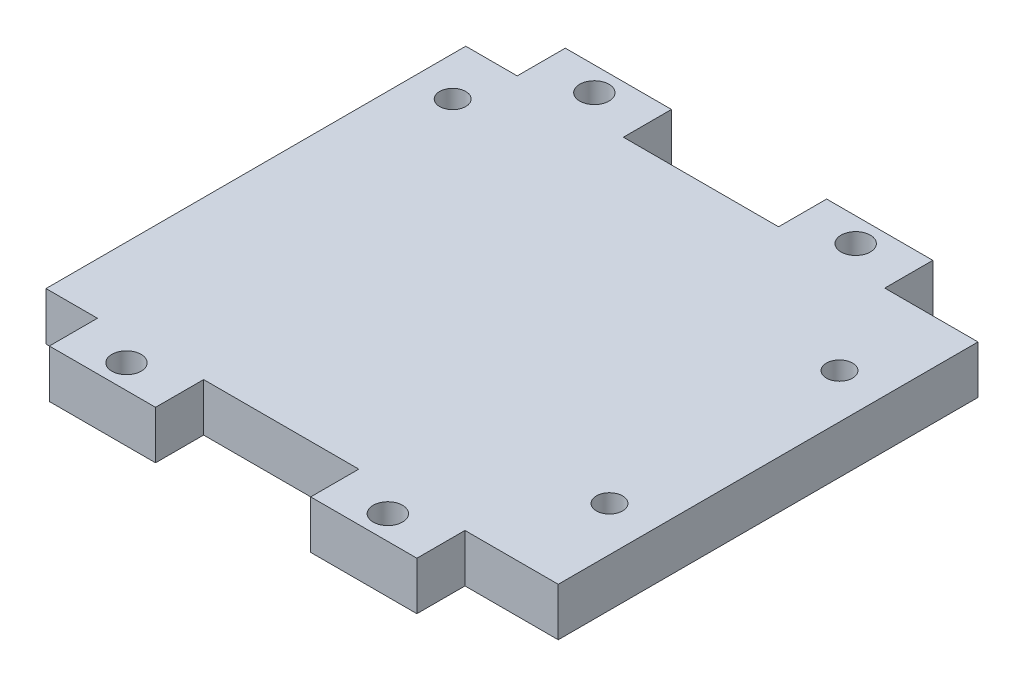
ISO-10303-21;
HEADER;
FILE_DESCRIPTION(('STEP AP214'),'2;1');
FILE_NAME('part.step','',(''),(''),'','','');
FILE_SCHEMA(('AUTOMOTIVE_DESIGN { 1 0 10303 214 1 1 1 1 }'));
ENDSEC;
DATA;
#1=APPLICATION_CONTEXT('core data for automotive mechanical design processes');
#2=APPLICATION_PROTOCOL_DEFINITION('international standard','automotive_design',2000,#1);
#3=PRODUCT_CONTEXT('',#1,'mechanical');
#4=PRODUCT('Part','Part','',(#3));
#5=PRODUCT_RELATED_PRODUCT_CATEGORY('part','',(#4));
#6=PRODUCT_DEFINITION_FORMATION('','',#4);
#7=PRODUCT_DEFINITION_CONTEXT('part definition',#1,'design');
#8=PRODUCT_DEFINITION('design','',#6,#7);
#9=PRODUCT_DEFINITION_SHAPE('','',#8);
#10=(LENGTH_UNIT() NAMED_UNIT(*) SI_UNIT(.MILLI.,.METRE.));
#11=(NAMED_UNIT(*) PLANE_ANGLE_UNIT() SI_UNIT($,.RADIAN.));
#12=(NAMED_UNIT(*) SI_UNIT($,.STERADIAN.) SOLID_ANGLE_UNIT());
#13=UNCERTAINTY_MEASURE_WITH_UNIT(LENGTH_MEASURE(1.E-05),#10,'distance_accuracy_value','');
#14=(GEOMETRIC_REPRESENTATION_CONTEXT(3) GLOBAL_UNCERTAINTY_ASSIGNED_CONTEXT((#13)) GLOBAL_UNIT_ASSIGNED_CONTEXT((#10,
#11,#12)) REPRESENTATION_CONTEXT('',''));
#15=CARTESIAN_POINT('',(0.,0.,0.));
#16=DIRECTION('',(0.,0.,1.));
#17=DIRECTION('',(1.,0.,0.));
#18=AXIS2_PLACEMENT_3D('',#15,#16,#17);
#19=CARTESIAN_POINT('',(0.,5.842,31.339536));
#20=DIRECTION('',(0.,0.,1.));
#21=DIRECTION('',(1.,0.,0.));
#22=AXIS2_PLACEMENT_3D('',#19,#20,#21);
#23=PLANE('',#22);
#24=DIRECTION('',(-1.,0.,0.));
#25=VECTOR('',#24,1.);
#26=CARTESIAN_POINT('',(0.,0.,31.339536));
#27=LINE('',#26,#25);
#28=CARTESIAN_POINT('',(22.325,0.,31.339536));
#29=VERTEX_POINT('',#28);
#30=CARTESIAN_POINT('',(9.42500000000002,0.,31.339536));
#31=VERTEX_POINT('',#30);
#32=EDGE_CURVE('E191',#29,#31,#27,.T.);
#33=ORIENTED_EDGE('',*,*,#32,.F.);
#34=DIRECTION('',(0.,-1.,0.));
#35=VECTOR('',#34,1.);
#36=CARTESIAN_POINT('',(22.325,5.842,31.339536));
#37=LINE('',#36,#35);
#38=CARTESIAN_POINT('',(22.325,5.842,31.339536));
#39=VERTEX_POINT('',#38);
#40=EDGE_CURVE('E11',#39,#29,#37,.T.);
#41=ORIENTED_EDGE('',*,*,#40,.F.);
#42=DIRECTION('',(-1.,0.,0.));
#43=VECTOR('',#42,1.);
#44=CARTESIAN_POINT('',(0.,5.842,31.339536));
#45=LINE('',#44,#43);
#46=CARTESIAN_POINT('',(9.42500000000002,5.842,31.339536));
#47=VERTEX_POINT('',#46);
#48=EDGE_CURVE('E242',#39,#47,#45,.T.);
#49=ORIENTED_EDGE('',*,*,#48,.T.);
#50=DIRECTION('',(0.,-1.,0.));
#51=VECTOR('',#50,1.);
#52=CARTESIAN_POINT('',(9.42500000000002,5.842,31.339536));
#53=LINE('',#52,#51);
#54=EDGE_CURVE('E116',#47,#31,#53,.T.);
#55=ORIENTED_EDGE('',*,*,#54,.T.);
#56=EDGE_LOOP('',(#33,#41,#49,#55));
#57=FACE_BOUND('',#56,.T.);
#58=ADVANCED_FACE('F35',(#57),#23,.T.);
#59=CARTESIAN_POINT('',(22.325,5.842,0.));
#60=DIRECTION('',(1.,0.,0.));
#61=DIRECTION('',(0.,0.,-1.));
#62=AXIS2_PLACEMENT_3D('',#59,#60,#61);
#63=PLANE('',#62);
#64=DIRECTION('',(0.,0.,1.));
#65=VECTOR('',#64,1.);
#66=CARTESIAN_POINT('',(22.325,0.,0.));
#67=LINE('',#66,#65);
#68=CARTESIAN_POINT('',(22.325,0.,25.497536));
#69=VERTEX_POINT('',#68);
#70=EDGE_CURVE('E194',#69,#29,#67,.T.);
#71=ORIENTED_EDGE('',*,*,#70,.F.);
#72=DIRECTION('',(0.,-1.,0.));
#73=VECTOR('',#72,1.);
#74=CARTESIAN_POINT('',(22.325,5.842,25.497536));
#75=LINE('',#74,#73);
#76=CARTESIAN_POINT('',(22.325,5.842,25.497536));
#77=VERTEX_POINT('',#76);
#78=EDGE_CURVE('E43',#77,#69,#75,.T.);
#79=ORIENTED_EDGE('',*,*,#78,.F.);
#80=DIRECTION('',(0.,0.,1.));
#81=VECTOR('',#80,1.);
#82=CARTESIAN_POINT('',(22.325,5.842,0.));
#83=LINE('',#82,#81);
#84=EDGE_CURVE('E290',#77,#39,#83,.T.);
#85=ORIENTED_EDGE('',*,*,#84,.T.);
#86=ORIENTED_EDGE('',*,*,#40,.T.);
#87=EDGE_LOOP('',(#71,#79,#85,#86));
#88=FACE_BOUND('',#87,.T.);
#89=ADVANCED_FACE('F289',(#88),#63,.T.);
#90=CARTESIAN_POINT('',(0.,5.842,25.497536));
#91=DIRECTION('',(0.,0.,-1.));
#92=DIRECTION('',(-1.,0.,0.));
#93=AXIS2_PLACEMENT_3D('',#90,#91,#92);
#94=PLANE('',#93);
#95=DIRECTION('',(1.,0.,0.));
#96=VECTOR('',#95,1.);
#97=CARTESIAN_POINT('',(0.,0.,25.497536));
#98=LINE('',#97,#96);
#99=CARTESIAN_POINT('',(33.655,0.,25.497536));
#100=VERTEX_POINT('',#99);
#101=EDGE_CURVE('E198',#69,#100,#98,.T.);
#102=ORIENTED_EDGE('',*,*,#101,.T.);
#103=DIRECTION('',(0.,1.,0.));
#104=VECTOR('',#103,1.);
#105=CARTESIAN_POINT('',(33.655,-51.2474757259827,25.497536));
#106=LINE('',#105,#104);
#107=CARTESIAN_POINT('',(33.655,5.842,25.497536));
#108=VERTEX_POINT('',#107);
#109=EDGE_CURVE('E392',#100,#108,#106,.T.);
#110=ORIENTED_EDGE('',*,*,#109,.T.);
#111=DIRECTION('',(1.,0.,0.));
#112=VECTOR('',#111,1.);
#113=CARTESIAN_POINT('',(0.,5.842,25.497536));
#114=LINE('',#113,#112);
#115=EDGE_CURVE('E279',#77,#108,#114,.T.);
#116=ORIENTED_EDGE('',*,*,#115,.F.);
#117=ORIENTED_EDGE('',*,*,#78,.T.);
#118=EDGE_LOOP('',(#102,#110,#116,#117));
#119=FACE_BOUND('',#118,.T.);
#120=ADVANCED_FACE('F274',(#119),#94,.F.);
#121=CARTESIAN_POINT('',(0.,5.842,-25.497536));
#122=DIRECTION('',(0.,0.,-1.));
#123=DIRECTION('',(-1.,0.,0.));
#124=AXIS2_PLACEMENT_3D('',#121,#122,#123);
#125=PLANE('',#124);
#126=DIRECTION('',(1.,0.,0.));
#127=VECTOR('',#126,1.);
#128=CARTESIAN_POINT('',(0.,0.,-25.497536));
#129=LINE('',#128,#127);
#130=CARTESIAN_POINT('',(22.325,0.,-25.497536));
#131=VERTEX_POINT('',#130);
#132=CARTESIAN_POINT('',(33.655,0.,-25.497536));
#133=VERTEX_POINT('',#132);
#134=EDGE_CURVE('E201',#131,#133,#129,.T.);
#135=ORIENTED_EDGE('',*,*,#134,.F.);
#136=DIRECTION('',(0.,-1.,0.));
#137=VECTOR('',#136,1.);
#138=CARTESIAN_POINT('',(22.325,5.842,-25.497536));
#139=LINE('',#138,#137);
#140=CARTESIAN_POINT('',(22.325,5.842,-25.497536));
#141=VERTEX_POINT('',#140);
#142=EDGE_CURVE('E270',#141,#131,#139,.T.);
#143=ORIENTED_EDGE('',*,*,#142,.F.);
#144=DIRECTION('',(1.,0.,0.));
#145=VECTOR('',#144,1.);
#146=CARTESIAN_POINT('',(0.,5.842,-25.497536));
#147=LINE('',#146,#145);
#148=CARTESIAN_POINT('',(33.655,5.842,-25.497536));
#149=VERTEX_POINT('',#148);
#150=EDGE_CURVE('E301',#141,#149,#147,.T.);
#151=ORIENTED_EDGE('',*,*,#150,.T.);
#152=DIRECTION('',(0.,1.,0.));
#153=VECTOR('',#152,1.);
#154=CARTESIAN_POINT('',(33.655,-51.2474757259827,-25.497536));
#155=LINE('',#154,#153);
#156=EDGE_CURVE('E387',#133,#149,#155,.T.);
#157=ORIENTED_EDGE('',*,*,#156,.F.);
#158=EDGE_LOOP('',(#135,#143,#151,#157));
#159=FACE_BOUND('',#158,.T.);
#160=ADVANCED_FACE('F383',(#159),#125,.T.);
#161=CARTESIAN_POINT('',(22.325,5.842,0.));
#162=DIRECTION('',(-1.,0.,0.));
#163=DIRECTION('',(0.,0.,1.));
#164=AXIS2_PLACEMENT_3D('',#161,#162,#163);
#165=PLANE('',#164);
#166=DIRECTION('',(0.,0.,-1.));
#167=VECTOR('',#166,1.);
#168=CARTESIAN_POINT('',(22.325,0.,0.));
#169=LINE('',#168,#167);
#170=CARTESIAN_POINT('',(22.325,0.,-31.339536));
#171=VERTEX_POINT('',#170);
#172=EDGE_CURVE('E204',#131,#171,#169,.T.);
#173=ORIENTED_EDGE('',*,*,#172,.T.);
#174=DIRECTION('',(0.,-1.,0.));
#175=VECTOR('',#174,1.);
#176=CARTESIAN_POINT('',(22.325,5.842,-31.339536));
#177=LINE('',#176,#175);
#178=CARTESIAN_POINT('',(22.325,5.842,-31.339536));
#179=VERTEX_POINT('',#178);
#180=EDGE_CURVE('E267',#179,#171,#177,.T.);
#181=ORIENTED_EDGE('',*,*,#180,.F.);
#182=DIRECTION('',(0.,0.,-1.));
#183=VECTOR('',#182,1.);
#184=CARTESIAN_POINT('',(22.325,5.842,0.));
#185=LINE('',#184,#183);
#186=EDGE_CURVE('E304',#141,#179,#185,.T.);
#187=ORIENTED_EDGE('',*,*,#186,.F.);
#188=ORIENTED_EDGE('',*,*,#142,.T.);
#189=EDGE_LOOP('',(#173,#181,#187,#188));
#190=FACE_BOUND('',#189,.T.);
#191=ADVANCED_FACE('F380',(#190),#165,.F.);
#192=CARTESIAN_POINT('',(0.,5.842,-31.339536));
#193=DIRECTION('',(0.,0.,1.));
#194=DIRECTION('',(1.,0.,0.));
#195=AXIS2_PLACEMENT_3D('',#192,#193,#194);
#196=PLANE('',#195);
#197=DIRECTION('',(-1.,0.,0.));
#198=VECTOR('',#197,1.);
#199=CARTESIAN_POINT('',(0.,0.,-31.339536));
#200=LINE('',#199,#198);
#201=CARTESIAN_POINT('',(9.425,0.,-31.339536));
#202=VERTEX_POINT('',#201);
#203=EDGE_CURVE('E206',#171,#202,#200,.T.);
#204=ORIENTED_EDGE('',*,*,#203,.T.);
#205=DIRECTION('',(0.,-1.,0.));
#206=VECTOR('',#205,1.);
#207=CARTESIAN_POINT('',(9.425,5.842,-31.339536));
#208=LINE('',#207,#206);
#209=CARTESIAN_POINT('',(9.425,5.842,-31.339536));
#210=VERTEX_POINT('',#209);
#211=EDGE_CURVE('E265',#210,#202,#208,.T.);
#212=ORIENTED_EDGE('',*,*,#211,.F.);
#213=DIRECTION('',(-1.,0.,0.));
#214=VECTOR('',#213,1.);
#215=CARTESIAN_POINT('',(0.,5.842,-31.339536));
#216=LINE('',#215,#214);
#217=EDGE_CURVE('E306',#179,#210,#216,.T.);
#218=ORIENTED_EDGE('',*,*,#217,.F.);
#219=ORIENTED_EDGE('',*,*,#180,.T.);
#220=EDGE_LOOP('',(#204,#212,#218,#219));
#221=FACE_BOUND('',#220,.T.);
#222=ADVANCED_FACE('F375',(#221),#196,.F.);
#223=CARTESIAN_POINT('',(9.425,5.842,0.));
#224=DIRECTION('',(-1.,0.,0.));
#225=DIRECTION('',(0.,0.,1.));
#226=AXIS2_PLACEMENT_3D('',#223,#224,#225);
#227=PLANE('',#226);
#228=DIRECTION('',(0.,0.,-1.));
#229=VECTOR('',#228,1.);
#230=CARTESIAN_POINT('',(9.425,0.,0.));
#231=LINE('',#230,#229);
#232=CARTESIAN_POINT('',(9.425,0.,-25.497536));
#233=VERTEX_POINT('',#232);
#234=EDGE_CURVE('E209',#233,#202,#231,.T.);
#235=ORIENTED_EDGE('',*,*,#234,.F.);
#236=DIRECTION('',(0.,-1.,0.));
#237=VECTOR('',#236,1.);
#238=CARTESIAN_POINT('',(9.425,5.842,-25.497536));
#239=LINE('',#238,#237);
#240=CARTESIAN_POINT('',(9.425,5.842,-25.497536));
#241=VERTEX_POINT('',#240);
#242=EDGE_CURVE('E263',#241,#233,#239,.T.);
#243=ORIENTED_EDGE('',*,*,#242,.F.);
#244=DIRECTION('',(0.,0.,-1.));
#245=VECTOR('',#244,1.);
#246=CARTESIAN_POINT('',(9.425,5.842,0.));
#247=LINE('',#246,#245);
#248=EDGE_CURVE('E308',#241,#210,#247,.T.);
#249=ORIENTED_EDGE('',*,*,#248,.T.);
#250=ORIENTED_EDGE('',*,*,#211,.T.);
#251=EDGE_LOOP('',(#235,#243,#249,#250));
#252=FACE_BOUND('',#251,.T.);
#253=ADVANCED_FACE('F369',(#252),#227,.T.);
#254=CARTESIAN_POINT('',(0.,5.842,-25.497536));
#255=DIRECTION('',(0.,0.,-1.));
#256=DIRECTION('',(-1.,0.,0.));
#257=AXIS2_PLACEMENT_3D('',#254,#255,#256);
#258=PLANE('',#257);
#259=DIRECTION('',(1.,0.,0.));
#260=VECTOR('',#259,1.);
#261=CARTESIAN_POINT('',(0.,0.,-25.497536));
#262=LINE('',#261,#260);
#263=CARTESIAN_POINT('',(-9.425,0.,-25.497536));
#264=VERTEX_POINT('',#263);
#265=EDGE_CURVE('E212',#264,#233,#262,.T.);
#266=ORIENTED_EDGE('',*,*,#265,.F.);
#267=DIRECTION('',(0.,-1.,0.));
#268=VECTOR('',#267,1.);
#269=CARTESIAN_POINT('',(-9.425,5.842,-25.497536));
#270=LINE('',#269,#268);
#271=CARTESIAN_POINT('',(-9.425,5.842,-25.497536));
#272=VERTEX_POINT('',#271);
#273=EDGE_CURVE('E261',#272,#264,#270,.T.);
#274=ORIENTED_EDGE('',*,*,#273,.F.);
#275=DIRECTION('',(1.,0.,0.));
#276=VECTOR('',#275,1.);
#277=CARTESIAN_POINT('',(0.,5.842,-25.497536));
#278=LINE('',#277,#276);
#279=EDGE_CURVE('E311',#272,#241,#278,.T.);
#280=ORIENTED_EDGE('',*,*,#279,.T.);
#281=ORIENTED_EDGE('',*,*,#242,.T.);
#282=EDGE_LOOP('',(#266,#274,#280,#281));
#283=FACE_BOUND('',#282,.T.);
#284=ADVANCED_FACE('F364',(#283),#258,.T.);
#285=CARTESIAN_POINT('',(-9.425,5.842,0.));
#286=DIRECTION('',(-1.,0.,0.));
#287=DIRECTION('',(0.,0.,1.));
#288=AXIS2_PLACEMENT_3D('',#285,#286,#287);
#289=PLANE('',#288);
#290=DIRECTION('',(0.,0.,-1.));
#291=VECTOR('',#290,1.);
#292=CARTESIAN_POINT('',(-9.425,0.,0.));
#293=LINE('',#292,#291);
#294=CARTESIAN_POINT('',(-9.425,0.,-31.339536));
#295=VERTEX_POINT('',#294);
#296=EDGE_CURVE('E215',#264,#295,#293,.T.);
#297=ORIENTED_EDGE('',*,*,#296,.T.);
#298=DIRECTION('',(0.,-1.,0.));
#299=VECTOR('',#298,1.);
#300=CARTESIAN_POINT('',(-9.425,5.842,-31.339536));
#301=LINE('',#300,#299);
#302=CARTESIAN_POINT('',(-9.425,5.842,-31.339536));
#303=VERTEX_POINT('',#302);
#304=EDGE_CURVE('E259',#303,#295,#301,.T.);
#305=ORIENTED_EDGE('',*,*,#304,.F.);
#306=DIRECTION('',(0.,0.,-1.));
#307=VECTOR('',#306,1.);
#308=CARTESIAN_POINT('',(-9.425,5.842,0.));
#309=LINE('',#308,#307);
#310=EDGE_CURVE('E314',#272,#303,#309,.T.);
#311=ORIENTED_EDGE('',*,*,#310,.F.);
#312=ORIENTED_EDGE('',*,*,#273,.T.);
#313=EDGE_LOOP('',(#297,#305,#311,#312));
#314=FACE_BOUND('',#313,.T.);
#315=ADVANCED_FACE('F361',(#314),#289,.F.);
#316=CARTESIAN_POINT('',(0.,5.842,-31.339536));
#317=DIRECTION('',(0.,0.,-1.));
#318=DIRECTION('',(-1.,0.,0.));
#319=AXIS2_PLACEMENT_3D('',#316,#317,#318);
#320=PLANE('',#319);
#321=DIRECTION('',(1.,0.,0.));
#322=VECTOR('',#321,1.);
#323=CARTESIAN_POINT('',(0.,0.,-31.339536));
#324=LINE('',#323,#322);
#325=CARTESIAN_POINT('',(-22.325,0.,-31.339536));
#326=VERTEX_POINT('',#325);
#327=EDGE_CURVE('E218',#326,#295,#324,.T.);
#328=ORIENTED_EDGE('',*,*,#327,.F.);
#329=DIRECTION('',(0.,-1.,0.));
#330=VECTOR('',#329,1.);
#331=CARTESIAN_POINT('',(-22.325,5.842,-31.339536));
#332=LINE('',#331,#330);
#333=CARTESIAN_POINT('',(-22.325,5.842,-31.339536));
#334=VERTEX_POINT('',#333);
#335=EDGE_CURVE('E257',#334,#326,#332,.T.);
#336=ORIENTED_EDGE('',*,*,#335,.F.);
#337=DIRECTION('',(1.,0.,0.));
#338=VECTOR('',#337,1.);
#339=CARTESIAN_POINT('',(0.,5.842,-31.339536));
#340=LINE('',#339,#338);
#341=EDGE_CURVE('E316',#334,#303,#340,.T.);
#342=ORIENTED_EDGE('',*,*,#341,.T.);
#343=ORIENTED_EDGE('',*,*,#304,.T.);
#344=EDGE_LOOP('',(#328,#336,#342,#343));
#345=FACE_BOUND('',#344,.T.);
#346=ADVANCED_FACE('F357',(#345),#320,.T.);
#347=CARTESIAN_POINT('',(-22.325,5.842,0.));
#348=DIRECTION('',(-1.,0.,0.));
#349=DIRECTION('',(0.,0.,1.));
#350=AXIS2_PLACEMENT_3D('',#347,#348,#349);
#351=PLANE('',#350);
#352=DIRECTION('',(0.,0.,-1.));
#353=VECTOR('',#352,1.);
#354=CARTESIAN_POINT('',(-22.325,0.,0.));
#355=LINE('',#354,#353);
#356=CARTESIAN_POINT('',(-22.325,0.,-25.497536));
#357=VERTEX_POINT('',#356);
#358=EDGE_CURVE('E221',#357,#326,#355,.T.);
#359=ORIENTED_EDGE('',*,*,#358,.F.);
#360=DIRECTION('',(0.,-1.,0.));
#361=VECTOR('',#360,1.);
#362=CARTESIAN_POINT('',(-22.325,5.842,-25.497536));
#363=LINE('',#362,#361);
#364=CARTESIAN_POINT('',(-22.325,5.842,-25.497536));
#365=VERTEX_POINT('',#364);
#366=EDGE_CURVE('E255',#365,#357,#363,.T.);
#367=ORIENTED_EDGE('',*,*,#366,.F.);
#368=DIRECTION('',(0.,0.,-1.));
#369=VECTOR('',#368,1.);
#370=CARTESIAN_POINT('',(-22.325,5.842,0.));
#371=LINE('',#370,#369);
#372=EDGE_CURVE('E319',#365,#334,#371,.T.);
#373=ORIENTED_EDGE('',*,*,#372,.T.);
#374=ORIENTED_EDGE('',*,*,#335,.T.);
#375=EDGE_LOOP('',(#359,#367,#373,#374));
#376=FACE_BOUND('',#375,.T.);
#377=ADVANCED_FACE('F353',(#376),#351,.T.);
#378=CARTESIAN_POINT('',(0.,5.842,-25.497536));
#379=DIRECTION('',(0.,0.,-1.));
#380=DIRECTION('',(-1.,0.,0.));
#381=AXIS2_PLACEMENT_3D('',#378,#379,#380);
#382=PLANE('',#381);
#383=DIRECTION('',(1.,0.,0.));
#384=VECTOR('',#383,1.);
#385=CARTESIAN_POINT('',(0.,0.,-25.497536));
#386=LINE('',#385,#384);
#387=CARTESIAN_POINT('',(-28.575,0.,-25.497536));
#388=VERTEX_POINT('',#387);
#389=EDGE_CURVE('E224',#388,#357,#386,.T.);
#390=ORIENTED_EDGE('',*,*,#389,.F.);
#391=DIRECTION('',(0.,-1.,0.));
#392=VECTOR('',#391,1.);
#393=CARTESIAN_POINT('',(-28.575,5.842,-25.497536));
#394=LINE('',#393,#392);
#395=CARTESIAN_POINT('',(-28.575,5.842,-25.497536));
#396=VERTEX_POINT('',#395);
#397=EDGE_CURVE('E253',#396,#388,#394,.T.);
#398=ORIENTED_EDGE('',*,*,#397,.F.);
#399=DIRECTION('',(1.,0.,0.));
#400=VECTOR('',#399,1.);
#401=CARTESIAN_POINT('',(0.,5.842,-25.497536));
#402=LINE('',#401,#400);
#403=EDGE_CURVE('E322',#396,#365,#402,.T.);
#404=ORIENTED_EDGE('',*,*,#403,.T.);
#405=ORIENTED_EDGE('',*,*,#366,.T.);
#406=EDGE_LOOP('',(#390,#398,#404,#405));
#407=FACE_BOUND('',#406,.T.);
#408=ADVANCED_FACE('F348',(#407),#382,.T.);
#409=CARTESIAN_POINT('',(-28.575,5.842,0.));
#410=DIRECTION('',(-1.,0.,0.));
#411=DIRECTION('',(0.,0.,1.));
#412=AXIS2_PLACEMENT_3D('',#409,#410,#411);
#413=PLANE('',#412);
#414=DIRECTION('',(0.,0.,-1.));
#415=VECTOR('',#414,1.);
#416=CARTESIAN_POINT('',(-28.575,0.,0.));
#417=LINE('',#416,#415);
#418=CARTESIAN_POINT('',(-28.575,0.,25.497536));
#419=VERTEX_POINT('',#418);
#420=EDGE_CURVE('E227',#419,#388,#417,.T.);
#421=ORIENTED_EDGE('',*,*,#420,.F.);
#422=DIRECTION('',(0.,-1.,0.));
#423=VECTOR('',#422,1.);
#424=CARTESIAN_POINT('',(-28.575,5.842,25.497536));
#425=LINE('',#424,#423);
#426=CARTESIAN_POINT('',(-28.575,5.842,25.497536));
#427=VERTEX_POINT('',#426);
#428=EDGE_CURVE('E251',#427,#419,#425,.T.);
#429=ORIENTED_EDGE('',*,*,#428,.F.);
#430=DIRECTION('',(0.,0.,-1.));
#431=VECTOR('',#430,1.);
#432=CARTESIAN_POINT('',(-28.575,5.842,0.));
#433=LINE('',#432,#431);
#434=EDGE_CURVE('E325',#427,#396,#433,.T.);
#435=ORIENTED_EDGE('',*,*,#434,.T.);
#436=ORIENTED_EDGE('',*,*,#397,.T.);
#437=EDGE_LOOP('',(#421,#429,#435,#436));
#438=FACE_BOUND('',#437,.T.);
#439=ADVANCED_FACE('F344',(#438),#413,.T.);
#440=CARTESIAN_POINT('',(0.,5.842,25.4975360000001));
#441=DIRECTION('',(0.,0.,-1.));
#442=DIRECTION('',(-1.,0.,0.));
#443=AXIS2_PLACEMENT_3D('',#440,#441,#442);
#444=PLANE('',#443);
#445=DIRECTION('',(1.,0.,0.));
#446=VECTOR('',#445,1.);
#447=CARTESIAN_POINT('',(0.,0.,25.4975360000001));
#448=LINE('',#447,#446);
#449=CARTESIAN_POINT('',(-22.325,0.,25.497536));
#450=VERTEX_POINT('',#449);
#451=EDGE_CURVE('E230',#419,#450,#448,.T.);
#452=ORIENTED_EDGE('',*,*,#451,.T.);
#453=DIRECTION('',(0.,-1.,0.));
#454=VECTOR('',#453,1.);
#455=CARTESIAN_POINT('',(-22.325,5.842,25.497536));
#456=LINE('',#455,#454);
#457=CARTESIAN_POINT('',(-22.325,5.842,25.497536));
#458=VERTEX_POINT('',#457);
#459=EDGE_CURVE('E248',#458,#450,#456,.T.);
#460=ORIENTED_EDGE('',*,*,#459,.F.);
#461=DIRECTION('',(1.,0.,0.));
#462=VECTOR('',#461,1.);
#463=CARTESIAN_POINT('',(0.,5.842,25.4975360000001));
#464=LINE('',#463,#462);
#465=EDGE_CURVE('E328',#427,#458,#464,.T.);
#466=ORIENTED_EDGE('',*,*,#465,.F.);
#467=ORIENTED_EDGE('',*,*,#428,.T.);
#468=EDGE_LOOP('',(#452,#460,#466,#467));
#469=FACE_BOUND('',#468,.T.);
#470=ADVANCED_FACE('F470',(#469),#444,.F.);
#471=CARTESIAN_POINT('',(-22.325,5.842,0.));
#472=DIRECTION('',(1.,0.,0.));
#473=DIRECTION('',(0.,0.,-1.));
#474=AXIS2_PLACEMENT_3D('',#471,#472,#473);
#475=PLANE('',#474);
#476=DIRECTION('',(0.,0.,1.));
#477=VECTOR('',#476,1.);
#478=CARTESIAN_POINT('',(-22.325,0.,0.));
#479=LINE('',#478,#477);
#480=CARTESIAN_POINT('',(-22.325,0.,31.339536));
#481=VERTEX_POINT('',#480);
#482=EDGE_CURVE('E232',#450,#481,#479,.T.);
#483=ORIENTED_EDGE('',*,*,#482,.T.);
#484=DIRECTION('',(0.,-1.,0.));
#485=VECTOR('',#484,1.);
#486=CARTESIAN_POINT('',(-22.325,5.842,31.339536));
#487=LINE('',#486,#485);
#488=CARTESIAN_POINT('',(-22.325,5.842,31.339536));
#489=VERTEX_POINT('',#488);
#490=EDGE_CURVE('E246',#489,#481,#487,.T.);
#491=ORIENTED_EDGE('',*,*,#490,.F.);
#492=DIRECTION('',(0.,0.,1.));
#493=VECTOR('',#492,1.);
#494=CARTESIAN_POINT('',(-22.325,5.842,0.));
#495=LINE('',#494,#493);
#496=EDGE_CURVE('E186',#458,#489,#495,.T.);
#497=ORIENTED_EDGE('',*,*,#496,.F.);
#498=ORIENTED_EDGE('',*,*,#459,.T.);
#499=EDGE_LOOP('',(#483,#491,#497,#498));
#500=FACE_BOUND('',#499,.T.);
#501=ADVANCED_FACE('F335',(#500),#475,.F.);
#502=CARTESIAN_POINT('',(0.,5.842,31.339536));
#503=DIRECTION('',(0.,0.,1.));
#504=DIRECTION('',(1.,0.,0.));
#505=AXIS2_PLACEMENT_3D('',#502,#503,#504);
#506=PLANE('',#505);
#507=DIRECTION('',(-1.,0.,0.));
#508=VECTOR('',#507,1.);
#509=CARTESIAN_POINT('',(0.,0.,31.339536));
#510=LINE('',#509,#508);
#511=CARTESIAN_POINT('',(-9.42499999999996,0.,31.339536));
#512=VERTEX_POINT('',#511);
#513=EDGE_CURVE('E235',#512,#481,#510,.T.);
#514=ORIENTED_EDGE('',*,*,#513,.F.);
#515=DIRECTION('',(0.,-1.,0.));
#516=VECTOR('',#515,1.);
#517=CARTESIAN_POINT('',(-9.42499999999996,5.842,31.339536));
#518=LINE('',#517,#516);
#519=CARTESIAN_POINT('',(-9.42499999999996,5.842,31.339536));
#520=VERTEX_POINT('',#519);
#521=EDGE_CURVE('E175',#520,#512,#518,.T.);
#522=ORIENTED_EDGE('',*,*,#521,.F.);
#523=DIRECTION('',(-1.,0.,0.));
#524=VECTOR('',#523,1.);
#525=CARTESIAN_POINT('',(0.,5.842,31.339536));
#526=LINE('',#525,#524);
#527=EDGE_CURVE('E184',#520,#489,#526,.T.);
#528=ORIENTED_EDGE('',*,*,#527,.T.);
#529=ORIENTED_EDGE('',*,*,#490,.T.);
#530=EDGE_LOOP('',(#514,#522,#528,#529));
#531=FACE_BOUND('',#530,.T.);
#532=ADVANCED_FACE('F339',(#531),#506,.T.);
#533=CARTESIAN_POINT('',(-9.42500000000003,5.842,0.));
#534=DIRECTION('',(1.,0.,0.));
#535=DIRECTION('',(0.,0.,-1.));
#536=AXIS2_PLACEMENT_3D('',#533,#534,#535);
#537=PLANE('',#536);
#538=DIRECTION('',(0.,0.,1.));
#539=VECTOR('',#538,1.);
#540=CARTESIAN_POINT('',(-9.42500000000003,0.,0.));
#541=LINE('',#540,#539);
#542=CARTESIAN_POINT('',(-9.42499999999997,0.,25.497536));
#543=VERTEX_POINT('',#542);
#544=EDGE_CURVE('E174',#543,#512,#541,.T.);
#545=ORIENTED_EDGE('',*,*,#544,.F.);
#546=DIRECTION('',(0.,-1.,0.));
#547=VECTOR('',#546,1.);
#548=CARTESIAN_POINT('',(-9.42499999999997,5.842,25.497536));
#549=LINE('',#548,#547);
#550=CARTESIAN_POINT('',(-9.42499999999997,5.842,25.497536));
#551=VERTEX_POINT('',#550);
#552=EDGE_CURVE('E168',#551,#543,#549,.T.);
#553=ORIENTED_EDGE('',*,*,#552,.F.);
#554=DIRECTION('',(0.,0.,1.));
#555=VECTOR('',#554,1.);
#556=CARTESIAN_POINT('',(-9.42500000000003,5.842,0.));
#557=LINE('',#556,#555);
#558=EDGE_CURVE('E172',#551,#520,#557,.T.);
#559=ORIENTED_EDGE('',*,*,#558,.T.);
#560=ORIENTED_EDGE('',*,*,#521,.T.);
#561=EDGE_LOOP('',(#545,#553,#559,#560));
#562=FACE_BOUND('',#561,.T.);
#563=ADVANCED_FACE('F170',(#562),#537,.T.);
#564=CARTESIAN_POINT('',(0.,5.842,25.497536));
#565=DIRECTION('',(0.,0.,-1.));
#566=DIRECTION('',(-1.,0.,0.));
#567=AXIS2_PLACEMENT_3D('',#564,#565,#566);
#568=PLANE('',#567);
#569=DIRECTION('',(1.,0.,0.));
#570=VECTOR('',#569,1.);
#571=CARTESIAN_POINT('',(0.,0.,25.497536));
#572=LINE('',#571,#570);
#573=CARTESIAN_POINT('',(9.42500000000002,0.,25.497536));
#574=VERTEX_POINT('',#573);
#575=EDGE_CURVE('E109',#543,#574,#572,.T.);
#576=ORIENTED_EDGE('',*,*,#575,.T.);
#577=DIRECTION('',(0.,-1.,0.));
#578=VECTOR('',#577,1.);
#579=CARTESIAN_POINT('',(9.42500000000002,5.842,25.497536));
#580=LINE('',#579,#578);
#581=CARTESIAN_POINT('',(9.42500000000002,5.842,25.497536));
#582=VERTEX_POINT('',#581);
#583=EDGE_CURVE('E176',#582,#574,#580,.T.);
#584=ORIENTED_EDGE('',*,*,#583,.F.);
#585=DIRECTION('',(1.,0.,0.));
#586=VECTOR('',#585,1.);
#587=CARTESIAN_POINT('',(0.,5.842,25.497536));
#588=LINE('',#587,#586);
#589=EDGE_CURVE('E178',#551,#582,#588,.T.);
#590=ORIENTED_EDGE('',*,*,#589,.F.);
#591=ORIENTED_EDGE('',*,*,#552,.T.);
#592=EDGE_LOOP('',(#576,#584,#590,#591));
#593=FACE_BOUND('',#592,.T.);
#594=ADVANCED_FACE('F179',(#593),#568,.F.);
#595=CARTESIAN_POINT('',(9.42500000000002,5.842,0.));
#596=DIRECTION('',(1.,0.,0.));
#597=DIRECTION('',(0.,0.,-1.));
#598=AXIS2_PLACEMENT_3D('',#595,#596,#597);
#599=PLANE('',#598);
#600=DIRECTION('',(0.,0.,1.));
#601=VECTOR('',#600,1.);
#602=CARTESIAN_POINT('',(9.42500000000002,0.,0.));
#603=LINE('',#602,#601);
#604=EDGE_CURVE('E240',#574,#31,#603,.T.);
#605=ORIENTED_EDGE('',*,*,#604,.T.);
#606=ORIENTED_EDGE('',*,*,#54,.F.);
#607=DIRECTION('',(0.,0.,1.));
#608=VECTOR('',#607,1.);
#609=CARTESIAN_POINT('',(9.42500000000002,5.842,0.));
#610=LINE('',#609,#608);
#611=EDGE_CURVE('E51',#582,#47,#610,.T.);
#612=ORIENTED_EDGE('',*,*,#611,.F.);
#613=ORIENTED_EDGE('',*,*,#583,.T.);
#614=EDGE_LOOP('',(#605,#606,#612,#613));
#615=FACE_BOUND('',#614,.T.);
#616=ADVANCED_FACE('F293',(#615),#599,.F.);
#617=CARTESIAN_POINT('',(0.,5.842,0.));
#618=DIRECTION('',(0.,1.,0.));
#619=DIRECTION('',(0.,0.,1.));
#620=AXIS2_PLACEMENT_3D('',#617,#618,#619);
#621=PLANE('',#620);
#622=CARTESIAN_POINT('',(28.2575,5.842,13.872464));
#623=DIRECTION('',(0.,-1.,0.));
#624=DIRECTION('',(0.,0.,-1.));
#625=AXIS2_PLACEMENT_3D('',#622,#623,#624);
#626=CIRCLE('',#625,1.5875);
#627=CARTESIAN_POINT('',(28.2575,5.842,12.284964));
#628=VERTEX_POINT('',#627);
#629=EDGE_CURVE('E583',#628,#628,#626,.T.);
#630=ORIENTED_EDGE('',*,*,#629,.T.);
#631=EDGE_LOOP('',(#630));
#632=FACE_BOUND('',#631,.T.);
#633=CARTESIAN_POINT('',(28.2575,5.842,-14.067536));
#634=DIRECTION('',(0.,-1.,0.));
#635=DIRECTION('',(0.,0.,-1.));
#636=AXIS2_PLACEMENT_3D('',#633,#634,#635);
#637=CIRCLE('',#636,1.5875);
#638=CARTESIAN_POINT('',(28.2575,5.842,-15.655036));
#639=VERTEX_POINT('',#638);
#640=EDGE_CURVE('E591',#639,#639,#637,.T.);
#641=ORIENTED_EDGE('',*,*,#640,.T.);
#642=EDGE_LOOP('',(#641));
#643=FACE_BOUND('',#642,.T.);
#644=CARTESIAN_POINT('',(-23.8125,5.842,-19.147536));
#645=DIRECTION('',(0.,-1.,0.));
#646=DIRECTION('',(0.,0.,-1.));
#647=AXIS2_PLACEMENT_3D('',#644,#645,#646);
#648=CIRCLE('',#647,1.5875);
#649=CARTESIAN_POINT('',(-23.8125,5.842,-20.735036));
#650=VERTEX_POINT('',#649);
#651=EDGE_CURVE('E404',#650,#650,#648,.T.);
#652=ORIENTED_EDGE('',*,*,#651,.T.);
#653=EDGE_LOOP('',(#652));
#654=FACE_BOUND('',#653,.T.);
#655=CARTESIAN_POINT('',(15.875,5.842,28.418536));
#656=DIRECTION('',(0.,1.,0.));
#657=DIRECTION('',(0.,0.,-1.));
#658=AXIS2_PLACEMENT_3D('',#655,#656,#657);
#659=CIRCLE('',#658,1.778);
#660=CARTESIAN_POINT('',(15.875,5.842,26.640536));
#661=VERTEX_POINT('',#660);
#662=EDGE_CURVE('E393',#661,#661,#659,.T.);
#663=ORIENTED_EDGE('',*,*,#662,.F.);
#664=EDGE_LOOP('',(#663));
#665=FACE_BOUND('',#664,.T.);
#666=CARTESIAN_POINT('',(15.875,5.842,-28.418536));
#667=DIRECTION('',(0.,1.,0.));
#668=DIRECTION('',(0.,0.,-1.));
#669=AXIS2_PLACEMENT_3D('',#666,#667,#668);
#670=CIRCLE('',#669,1.778);
#671=CARTESIAN_POINT('',(15.875,5.842,-30.196536));
#672=VERTEX_POINT('',#671);
#673=EDGE_CURVE('E408',#672,#672,#670,.T.);
#674=ORIENTED_EDGE('',*,*,#673,.F.);
#675=EDGE_LOOP('',(#674));
#676=FACE_BOUND('',#675,.T.);
#677=CARTESIAN_POINT('',(-15.875,5.842,28.418536));
#678=DIRECTION('',(0.,1.,0.));
#679=DIRECTION('',(0.,0.,1.));
#680=AXIS2_PLACEMENT_3D('',#677,#678,#679);
#681=CIRCLE('',#680,1.778);
#682=CARTESIAN_POINT('',(-15.875,5.842,30.196536));
#683=VERTEX_POINT('',#682);
#684=EDGE_CURVE('E413',#683,#683,#681,.T.);
#685=ORIENTED_EDGE('',*,*,#684,.F.);
#686=EDGE_LOOP('',(#685));
#687=FACE_BOUND('',#686,.T.);
#688=CARTESIAN_POINT('',(-15.875,5.842,-28.418536));
#689=DIRECTION('',(0.,1.,0.));
#690=DIRECTION('',(0.,0.,1.));
#691=AXIS2_PLACEMENT_3D('',#688,#689,#690);
#692=CIRCLE('',#691,1.778);
#693=CARTESIAN_POINT('',(-15.875,5.842,-26.640536));
#694=VERTEX_POINT('',#693);
#695=EDGE_CURVE('E297',#694,#694,#692,.T.);
#696=ORIENTED_EDGE('',*,*,#695,.F.);
#697=EDGE_LOOP('',(#696));
#698=FACE_BOUND('',#697,.T.);
#699=ORIENTED_EDGE('',*,*,#48,.F.);
#700=ORIENTED_EDGE('',*,*,#84,.F.);
#701=ORIENTED_EDGE('',*,*,#115,.T.);
#702=DIRECTION('',(0.,0.,-1.));
#703=VECTOR('',#702,1.);
#704=CARTESIAN_POINT('',(33.655,5.842,-25.497536));
#705=LINE('',#704,#703);
#706=EDGE_CURVE('E403',#108,#149,#705,.T.);
#707=ORIENTED_EDGE('',*,*,#706,.T.);
#708=ORIENTED_EDGE('',*,*,#150,.F.);
#709=ORIENTED_EDGE('',*,*,#186,.T.);
#710=ORIENTED_EDGE('',*,*,#217,.T.);
#711=ORIENTED_EDGE('',*,*,#248,.F.);
#712=ORIENTED_EDGE('',*,*,#279,.F.);
#713=ORIENTED_EDGE('',*,*,#310,.T.);
#714=ORIENTED_EDGE('',*,*,#341,.F.);
#715=ORIENTED_EDGE('',*,*,#372,.F.);
#716=ORIENTED_EDGE('',*,*,#403,.F.);
#717=ORIENTED_EDGE('',*,*,#434,.F.);
#718=ORIENTED_EDGE('',*,*,#465,.T.);
#719=ORIENTED_EDGE('',*,*,#496,.T.);
#720=ORIENTED_EDGE('',*,*,#527,.F.);
#721=ORIENTED_EDGE('',*,*,#558,.F.);
#722=ORIENTED_EDGE('',*,*,#589,.T.);
#723=ORIENTED_EDGE('',*,*,#611,.T.);
#724=EDGE_LOOP('',(#699,#700,#701,#707,#708,#709,#710,#711,#712,#713,#714,#715,#716,#717,#718,
#719,#720,#721,#722,#723));
#725=FACE_BOUND('',#724,.T.);
#726=ADVANCED_FACE('F182',(#632,#643,#654,#665,#676,#687,#698,#725),#621,.T.);
#727=CARTESIAN_POINT('',(0.,0.,0.));
#728=DIRECTION('',(0.,1.,0.));
#729=DIRECTION('',(0.,0.,1.));
#730=AXIS2_PLACEMENT_3D('',#727,#728,#729);
#731=PLANE('',#730);
#732=CARTESIAN_POINT('',(28.2575,0.,13.872464));
#733=DIRECTION('',(0.,-1.,0.));
#734=DIRECTION('',(0.,0.,-1.));
#735=AXIS2_PLACEMENT_3D('',#732,#733,#734);
#736=CIRCLE('',#735,1.5875);
#737=CARTESIAN_POINT('',(28.2575,0.,12.284964));
#738=VERTEX_POINT('',#737);
#739=EDGE_CURVE('E586',#738,#738,#736,.T.);
#740=ORIENTED_EDGE('',*,*,#739,.F.);
#741=EDGE_LOOP('',(#740));
#742=FACE_BOUND('',#741,.T.);
#743=CARTESIAN_POINT('',(28.2575,0.,-14.067536));
#744=DIRECTION('',(0.,-1.,0.));
#745=DIRECTION('',(0.,0.,-1.));
#746=AXIS2_PLACEMENT_3D('',#743,#744,#745);
#747=CIRCLE('',#746,1.5875);
#748=CARTESIAN_POINT('',(28.2575,0.,-15.655036));
#749=VERTEX_POINT('',#748);
#750=EDGE_CURVE('E588',#749,#749,#747,.T.);
#751=ORIENTED_EDGE('',*,*,#750,.F.);
#752=EDGE_LOOP('',(#751));
#753=FACE_BOUND('',#752,.T.);
#754=CARTESIAN_POINT('',(-23.8125,0.,-19.147536));
#755=DIRECTION('',(0.,-1.,0.));
#756=DIRECTION('',(0.,0.,-1.));
#757=AXIS2_PLACEMENT_3D('',#754,#755,#756);
#758=CIRCLE('',#757,1.5875);
#759=CARTESIAN_POINT('',(-23.8125,0.,-20.735036));
#760=VERTEX_POINT('',#759);
#761=EDGE_CURVE('E401',#760,#760,#758,.T.);
#762=ORIENTED_EDGE('',*,*,#761,.F.);
#763=EDGE_LOOP('',(#762));
#764=FACE_BOUND('',#763,.T.);
#765=CARTESIAN_POINT('',(15.875,0.,28.418536));
#766=DIRECTION('',(0.,1.,0.));
#767=DIRECTION('',(0.,0.,-1.));
#768=AXIS2_PLACEMENT_3D('',#765,#766,#767);
#769=CIRCLE('',#768,1.778);
#770=CARTESIAN_POINT('',(15.875,0.,26.640536));
#771=VERTEX_POINT('',#770);
#772=EDGE_CURVE('E396',#771,#771,#769,.T.);
#773=ORIENTED_EDGE('',*,*,#772,.T.);
#774=EDGE_LOOP('',(#773));
#775=FACE_BOUND('',#774,.T.);
#776=CARTESIAN_POINT('',(15.875,0.,-28.418536));
#777=DIRECTION('',(0.,1.,0.));
#778=DIRECTION('',(0.,0.,-1.));
#779=AXIS2_PLACEMENT_3D('',#776,#777,#778);
#780=CIRCLE('',#779,1.778);
#781=CARTESIAN_POINT('',(15.875,0.,-30.196536));
#782=VERTEX_POINT('',#781);
#783=EDGE_CURVE('E410',#782,#782,#780,.T.);
#784=ORIENTED_EDGE('',*,*,#783,.T.);
#785=EDGE_LOOP('',(#784));
#786=FACE_BOUND('',#785,.T.);
#787=CARTESIAN_POINT('',(-15.875,0.,28.418536));
#788=DIRECTION('',(0.,1.,0.));
#789=DIRECTION('',(0.,0.,1.));
#790=AXIS2_PLACEMENT_3D('',#787,#788,#789);
#791=CIRCLE('',#790,1.778);
#792=CARTESIAN_POINT('',(-15.875,0.,30.196536));
#793=VERTEX_POINT('',#792);
#794=EDGE_CURVE('E416',#793,#793,#791,.T.);
#795=ORIENTED_EDGE('',*,*,#794,.T.);
#796=EDGE_LOOP('',(#795));
#797=FACE_BOUND('',#796,.T.);
#798=CARTESIAN_POINT('',(-15.875,0.,-28.418536));
#799=DIRECTION('',(0.,1.,0.));
#800=DIRECTION('',(0.,0.,1.));
#801=AXIS2_PLACEMENT_3D('',#798,#799,#800);
#802=CIRCLE('',#801,1.778);
#803=CARTESIAN_POINT('',(-15.875,0.,-26.640536));
#804=VERTEX_POINT('',#803);
#805=EDGE_CURVE('E195',#804,#804,#802,.T.);
#806=ORIENTED_EDGE('',*,*,#805,.T.);
#807=EDGE_LOOP('',(#806));
#808=FACE_BOUND('',#807,.T.);
#809=ORIENTED_EDGE('',*,*,#32,.T.);
#810=ORIENTED_EDGE('',*,*,#604,.F.);
#811=ORIENTED_EDGE('',*,*,#575,.F.);
#812=ORIENTED_EDGE('',*,*,#544,.T.);
#813=ORIENTED_EDGE('',*,*,#513,.T.);
#814=ORIENTED_EDGE('',*,*,#482,.F.);
#815=ORIENTED_EDGE('',*,*,#451,.F.);
#816=ORIENTED_EDGE('',*,*,#420,.T.);
#817=ORIENTED_EDGE('',*,*,#389,.T.);
#818=ORIENTED_EDGE('',*,*,#358,.T.);
#819=ORIENTED_EDGE('',*,*,#327,.T.);
#820=ORIENTED_EDGE('',*,*,#296,.F.);
#821=ORIENTED_EDGE('',*,*,#265,.T.);
#822=ORIENTED_EDGE('',*,*,#234,.T.);
#823=ORIENTED_EDGE('',*,*,#203,.F.);
#824=ORIENTED_EDGE('',*,*,#172,.F.);
#825=ORIENTED_EDGE('',*,*,#134,.T.);
#826=DIRECTION('',(0.,0.,1.));
#827=VECTOR('',#826,1.);
#828=CARTESIAN_POINT('',(33.655,0.,-25.497536));
#829=LINE('',#828,#827);
#830=EDGE_CURVE('E287',#133,#100,#829,.T.);
#831=ORIENTED_EDGE('',*,*,#830,.T.);
#832=ORIENTED_EDGE('',*,*,#101,.F.);
#833=ORIENTED_EDGE('',*,*,#70,.T.);
#834=EDGE_LOOP('',(#809,#810,#811,#812,#813,#814,#815,#816,#817,#818,#819,#820,#821,#822,#823,
#824,#825,#831,#832,#833));
#835=FACE_BOUND('',#834,.T.);
#836=ADVANCED_FACE('F285',(#742,#753,#764,#775,#786,#797,#808,#835),#731,.F.);
#837=CARTESIAN_POINT('',(-15.875,0.,-28.418536));
#838=DIRECTION('',(0.,1.,0.));
#839=DIRECTION('',(0.,0.,1.));
#840=AXIS2_PLACEMENT_3D('',#837,#838,#839);
#841=CYLINDRICAL_SURFACE('',#840,1.778);
#842=ORIENTED_EDGE('',*,*,#805,.F.);
#843=EDGE_LOOP('',(#842));
#844=FACE_BOUND('',#843,.T.);
#845=ORIENTED_EDGE('',*,*,#695,.T.);
#846=EDGE_LOOP('',(#845));
#847=FACE_BOUND('',#846,.T.);
#848=ADVANCED_FACE('F426',(#844,#847),#841,.F.);
#849=CARTESIAN_POINT('',(-15.875,0.,28.418536));
#850=DIRECTION('',(0.,1.,0.));
#851=DIRECTION('',(0.,0.,1.));
#852=AXIS2_PLACEMENT_3D('',#849,#850,#851);
#853=CYLINDRICAL_SURFACE('',#852,1.778);
#854=ORIENTED_EDGE('',*,*,#794,.F.);
#855=EDGE_LOOP('',(#854));
#856=FACE_BOUND('',#855,.T.);
#857=ORIENTED_EDGE('',*,*,#684,.T.);
#858=EDGE_LOOP('',(#857));
#859=FACE_BOUND('',#858,.T.);
#860=ADVANCED_FACE('F494',(#856,#859),#853,.F.);
#861=CARTESIAN_POINT('',(15.875,0.,-28.418536));
#862=DIRECTION('',(0.,1.,0.));
#863=DIRECTION('',(0.,0.,1.));
#864=AXIS2_PLACEMENT_3D('',#861,#862,#863);
#865=CYLINDRICAL_SURFACE('',#864,1.778);
#866=ORIENTED_EDGE('',*,*,#783,.F.);
#867=EDGE_LOOP('',(#866));
#868=FACE_BOUND('',#867,.T.);
#869=ORIENTED_EDGE('',*,*,#673,.T.);
#870=EDGE_LOOP('',(#869));
#871=FACE_BOUND('',#870,.T.);
#872=ADVANCED_FACE('F501',(#868,#871),#865,.F.);
#873=CARTESIAN_POINT('',(15.875,0.,28.418536));
#874=DIRECTION('',(0.,1.,0.));
#875=DIRECTION('',(0.,0.,1.));
#876=AXIS2_PLACEMENT_3D('',#873,#874,#875);
#877=CYLINDRICAL_SURFACE('',#876,1.778);
#878=ORIENTED_EDGE('',*,*,#772,.F.);
#879=EDGE_LOOP('',(#878));
#880=FACE_BOUND('',#879,.T.);
#881=ORIENTED_EDGE('',*,*,#662,.T.);
#882=EDGE_LOOP('',(#881));
#883=FACE_BOUND('',#882,.T.);
#884=ADVANCED_FACE('F509',(#880,#883),#877,.F.);
#885=CARTESIAN_POINT('',(33.655,-51.2474757259827,-25.497536));
#886=DIRECTION('',(1.,0.,0.));
#887=DIRECTION('',(0.,0.,-1.));
#888=AXIS2_PLACEMENT_3D('',#885,#886,#887);
#889=PLANE('',#888);
#890=ORIENTED_EDGE('',*,*,#830,.F.);
#891=ORIENTED_EDGE('',*,*,#156,.T.);
#892=ORIENTED_EDGE('',*,*,#706,.F.);
#893=ORIENTED_EDGE('',*,*,#109,.F.);
#894=EDGE_LOOP('',(#890,#891,#892,#893));
#895=FACE_BOUND('',#894,.T.);
#896=ADVANCED_FACE('F389',(#895),#889,.T.);
#897=CARTESIAN_POINT('',(-23.8125,5.842,-19.147536));
#898=DIRECTION('',(0.,-1.,0.));
#899=DIRECTION('',(0.,0.,-1.));
#900=AXIS2_PLACEMENT_3D('',#897,#898,#899);
#901=CYLINDRICAL_SURFACE('',#900,1.5875);
#902=ORIENTED_EDGE('',*,*,#651,.F.);
#903=EDGE_LOOP('',(#902));
#904=FACE_BOUND('',#903,.T.);
#905=ORIENTED_EDGE('',*,*,#761,.T.);
#906=EDGE_LOOP('',(#905));
#907=FACE_BOUND('',#906,.T.);
#908=ADVANCED_FACE('F549',(#904,#907),#901,.F.);
#909=CARTESIAN_POINT('',(28.2575,5.842,-14.067536));
#910=DIRECTION('',(0.,-1.,0.));
#911=DIRECTION('',(0.,0.,-1.));
#912=AXIS2_PLACEMENT_3D('',#909,#910,#911);
#913=CYLINDRICAL_SURFACE('',#912,1.5875);
#914=ORIENTED_EDGE('',*,*,#640,.F.);
#915=EDGE_LOOP('',(#914));
#916=FACE_BOUND('',#915,.T.);
#917=ORIENTED_EDGE('',*,*,#750,.T.);
#918=EDGE_LOOP('',(#917));
#919=FACE_BOUND('',#918,.T.);
#920=ADVANCED_FACE('F554',(#916,#919),#913,.F.);
#921=CARTESIAN_POINT('',(28.2575,5.842,13.872464));
#922=DIRECTION('',(0.,-1.,0.));
#923=DIRECTION('',(0.,0.,-1.));
#924=AXIS2_PLACEMENT_3D('',#921,#922,#923);
#925=CYLINDRICAL_SURFACE('',#924,1.5875);
#926=ORIENTED_EDGE('',*,*,#629,.F.);
#927=EDGE_LOOP('',(#926));
#928=FACE_BOUND('',#927,.T.);
#929=ORIENTED_EDGE('',*,*,#739,.T.);
#930=EDGE_LOOP('',(#929));
#931=FACE_BOUND('',#930,.T.);
#932=ADVANCED_FACE('F562',(#928,#931),#925,.F.);
#933=CLOSED_SHELL('',(#58,#89,#120,#160,#191,#222,#253,#284,#315,#346,#377,#408,#439,#470,#501,
#532,#563,#594,#616,#726,#836,#848,#860,#872,#884,#896,#908,#920,#932));
#934=MANIFOLD_SOLID_BREP('B2',#933);
#935=ADVANCED_BREP_SHAPE_REPRESENTATION('',(#18,#934),#14);
#936=SHAPE_DEFINITION_REPRESENTATION(#9,#935);
ENDSEC;
END-ISO-10303-21;
